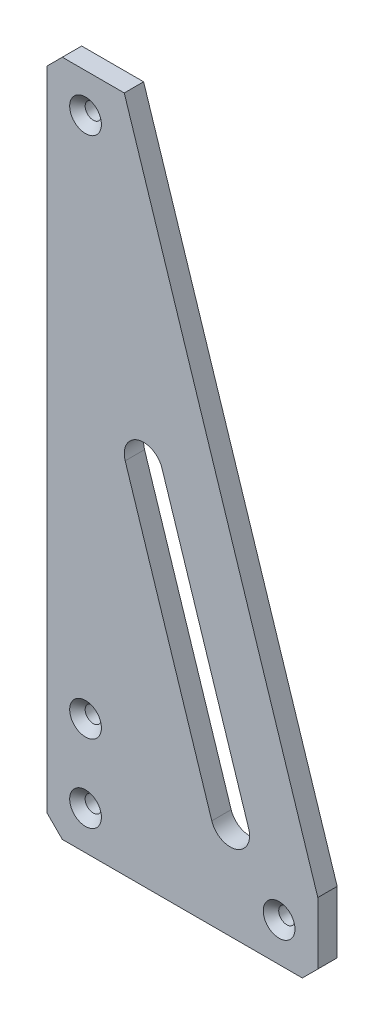
ISO-10303-21;
HEADER;
FILE_DESCRIPTION(('STEP AP214'),'2;1');
FILE_NAME('part.step','',(''),(''),'','','');
FILE_SCHEMA(('AUTOMOTIVE_DESIGN { 1 0 10303 214 1 1 1 1 }'));
ENDSEC;
DATA;
#1=APPLICATION_CONTEXT('core data for automotive mechanical design processes');
#2=APPLICATION_PROTOCOL_DEFINITION('international standard','automotive_design',2000,#1);
#3=PRODUCT_CONTEXT('',#1,'mechanical');
#4=PRODUCT('Part','Part','',(#3));
#5=PRODUCT_RELATED_PRODUCT_CATEGORY('part','',(#4));
#6=PRODUCT_DEFINITION_FORMATION('','',#4);
#7=PRODUCT_DEFINITION_CONTEXT('part definition',#1,'design');
#8=PRODUCT_DEFINITION('design','',#6,#7);
#9=PRODUCT_DEFINITION_SHAPE('','',#8);
#10=(LENGTH_UNIT() NAMED_UNIT(*) SI_UNIT(.MILLI.,.METRE.));
#11=(NAMED_UNIT(*) PLANE_ANGLE_UNIT() SI_UNIT($,.RADIAN.));
#12=(NAMED_UNIT(*) SI_UNIT($,.STERADIAN.) SOLID_ANGLE_UNIT());
#13=UNCERTAINTY_MEASURE_WITH_UNIT(LENGTH_MEASURE(1.E-05),#10,'distance_accuracy_value','');
#14=(GEOMETRIC_REPRESENTATION_CONTEXT(3) GLOBAL_UNCERTAINTY_ASSIGNED_CONTEXT((#13)) GLOBAL_UNIT_ASSIGNED_CONTEXT((#10,
#11,#12)) REPRESENTATION_CONTEXT('',''));
#15=CARTESIAN_POINT('',(0.,0.,0.));
#16=DIRECTION('',(0.,0.,1.));
#17=DIRECTION('',(1.,0.,0.));
#18=AXIS2_PLACEMENT_3D('',#15,#16,#17);
#19=CARTESIAN_POINT('',(0.,0.,2.5));
#20=DIRECTION('',(0.,0.,1.));
#21=DIRECTION('',(1.,0.,0.));
#22=AXIS2_PLACEMENT_3D('',#19,#20,#21);
#23=PLANE('',#22);
#24=CARTESIAN_POINT('',(12.3722613227067,-62.5,2.5));
#25=DIRECTION('',(0.,0.,-1.));
#26=DIRECTION('',(-1.,0.,0.));
#27=AXIS2_PLACEMENT_3D('',#24,#25,#26);
#28=CIRCLE('',#27,5.);
#29=CARTESIAN_POINT('',(17.1308044115095,-60.9649861003862,2.5));
#30=VERTEX_POINT('',#29);
#31=CARTESIAN_POINT('',(7.61371823390396,-64.0350138996138,2.5));
#32=VERTEX_POINT('',#31);
#33=EDGE_CURVE('E129',#30,#32,#28,.T.);
#34=ORIENTED_EDGE('',*,*,#33,.T.);
#35=DIRECTION('',(-0.307002779922759,0.951708617760551,0.));
#36=VECTOR('',#35,1.);
#37=CARTESIAN_POINT('',(7.61371823390396,-64.0350138996138,2.5));
#38=LINE('',#37,#36);
#39=CARTESIAN_POINT('',(-14.7585430888028,5.31899620077691,2.5));
#40=VERTEX_POINT('',#39);
#41=EDGE_CURVE('E138',#32,#40,#38,.T.);
#42=ORIENTED_EDGE('',*,*,#41,.T.);
#43=CARTESIAN_POINT('',(-10.,6.8540101003907,2.5));
#44=DIRECTION('',(0.,0.,-1.));
#45=DIRECTION('',(-1.,0.,0.));
#46=AXIS2_PLACEMENT_3D('',#43,#44,#45);
#47=CIRCLE('',#46,4.99999999999999);
#48=CARTESIAN_POINT('',(-5.24145691119726,8.3890240000045,2.5));
#49=VERTEX_POINT('',#48);
#50=EDGE_CURVE('E53',#40,#49,#47,.T.);
#51=ORIENTED_EDGE('',*,*,#50,.T.);
#52=DIRECTION('',(0.307002779922759,-0.951708617760551,0.));
#53=VECTOR('',#52,1.);
#54=CARTESIAN_POINT('',(17.1308044115095,-60.9649861003862,2.5));
#55=LINE('',#54,#53);
#56=EDGE_CURVE('E135',#49,#30,#55,.T.);
#57=ORIENTED_EDGE('',*,*,#56,.T.);
#58=EDGE_LOOP('',(#34,#42,#51,#57));
#59=FACE_BOUND('',#58,.T.);
#60=CARTESIAN_POINT('',(-25.,77.5,2.5));
#61=DIRECTION('',(0.,0.,1.));
#62=DIRECTION('',(1.,0.,0.));
#63=AXIS2_PLACEMENT_3D('',#60,#61,#62);
#64=CIRCLE('',#63,4.09999999999999);
#65=CARTESIAN_POINT('',(-20.9,77.5,2.5));
#66=VERTEX_POINT('',#65);
#67=EDGE_CURVE('E245',#66,#66,#64,.F.);
#68=ORIENTED_EDGE('',*,*,#67,.T.);
#69=EDGE_LOOP('',(#68));
#70=FACE_BOUND('',#69,.T.);
#71=CARTESIAN_POINT('',(25.,-77.5,2.5));
#72=DIRECTION('',(0.,0.,1.));
#73=DIRECTION('',(1.,0.,0.));
#74=AXIS2_PLACEMENT_3D('',#71,#72,#73);
#75=CIRCLE('',#74,4.09999999999999);
#76=CARTESIAN_POINT('',(29.1,-77.5,2.5));
#77=VERTEX_POINT('',#76);
#78=EDGE_CURVE('E242',#77,#77,#75,.F.);
#79=ORIENTED_EDGE('',*,*,#78,.T.);
#80=EDGE_LOOP('',(#79));
#81=FACE_BOUND('',#80,.T.);
#82=CARTESIAN_POINT('',(-25.,-57.5,2.5));
#83=DIRECTION('',(0.,0.,1.));
#84=DIRECTION('',(1.,0.,0.));
#85=AXIS2_PLACEMENT_3D('',#82,#83,#84);
#86=CIRCLE('',#85,4.10000000000002);
#87=CARTESIAN_POINT('',(-20.9,-57.5,2.5));
#88=VERTEX_POINT('',#87);
#89=EDGE_CURVE('E239',#88,#88,#86,.F.);
#90=ORIENTED_EDGE('',*,*,#89,.T.);
#91=EDGE_LOOP('',(#90));
#92=FACE_BOUND('',#91,.T.);
#93=CARTESIAN_POINT('',(-25.,-77.5,2.5));
#94=DIRECTION('',(0.,0.,1.));
#95=DIRECTION('',(1.,0.,0.));
#96=AXIS2_PLACEMENT_3D('',#93,#94,#95);
#97=CIRCLE('',#96,4.09999999999999);
#98=CARTESIAN_POINT('',(-20.9,-77.5,2.5));
#99=VERTEX_POINT('',#98);
#100=EDGE_CURVE('E236',#99,#99,#97,.F.);
#101=ORIENTED_EDGE('',*,*,#100,.T.);
#102=EDGE_LOOP('',(#101));
#103=FACE_BOUND('',#102,.T.);
#104=DIRECTION('',(1.,0.,0.));
#105=VECTOR('',#104,1.);
#106=CARTESIAN_POINT('',(-35.,-87.5,2.5));
#107=LINE('',#106,#105);
#108=CARTESIAN_POINT('',(-31.,-87.5,2.5));
#109=VERTEX_POINT('',#108);
#110=CARTESIAN_POINT('',(31.,-87.5,2.5));
#111=VERTEX_POINT('',#110);
#112=EDGE_CURVE('E175',#109,#111,#107,.T.);
#113=ORIENTED_EDGE('',*,*,#112,.T.);
#114=DIRECTION('',(-0.707106781186551,-0.707106781186544,0.));
#115=VECTOR('',#114,1.);
#116=CARTESIAN_POINT('',(59.2499999999999,-59.2500000000004,2.5));
#117=LINE('',#116,#115);
#118=CARTESIAN_POINT('',(35.,-83.5,2.5));
#119=VERTEX_POINT('',#118);
#120=EDGE_CURVE('E224',#111,#119,#117,.F.);
#121=ORIENTED_EDGE('',*,*,#120,.T.);
#122=DIRECTION('',(0.,1.,0.));
#123=VECTOR('',#122,1.);
#124=CARTESIAN_POINT('',(35.,-87.5,2.5));
#125=LINE('',#124,#123);
#126=CARTESIAN_POINT('',(35.,-67.5,2.5));
#127=VERTEX_POINT('',#126);
#128=EDGE_CURVE('E178',#119,#127,#125,.T.);
#129=ORIENTED_EDGE('',*,*,#128,.T.);
#130=DIRECTION('',(-0.307002779922759,0.951708617760551,0.));
#131=VECTOR('',#130,1.);
#132=CARTESIAN_POINT('',(35.,-67.5,2.5));
#133=LINE('',#132,#131);
#134=CARTESIAN_POINT('',(-15.,87.5,2.5));
#135=VERTEX_POINT('',#134);
#136=EDGE_CURVE('E181',#127,#135,#133,.T.);
#137=ORIENTED_EDGE('',*,*,#136,.T.);
#138=DIRECTION('',(-1.,0.,0.));
#139=VECTOR('',#138,1.);
#140=CARTESIAN_POINT('',(-15.,87.5,2.5));
#141=LINE('',#140,#139);
#142=CARTESIAN_POINT('',(-31.,87.5,2.5));
#143=VERTEX_POINT('',#142);
#144=EDGE_CURVE('E183',#135,#143,#141,.T.);
#145=ORIENTED_EDGE('',*,*,#144,.T.);
#146=DIRECTION('',(0.70710678118655,0.707106781186545,0.));
#147=VECTOR('',#146,1.);
#148=CARTESIAN_POINT('',(-59.2499999999999,59.2500000000003,2.5));
#149=LINE('',#148,#147);
#150=CARTESIAN_POINT('',(-35.,83.5,2.5));
#151=VERTEX_POINT('',#150);
#152=EDGE_CURVE('E220',#143,#151,#149,.F.);
#153=ORIENTED_EDGE('',*,*,#152,.T.);
#154=DIRECTION('',(0.,-1.,0.));
#155=VECTOR('',#154,1.);
#156=CARTESIAN_POINT('',(-35.,87.5,2.5));
#157=LINE('',#156,#155);
#158=CARTESIAN_POINT('',(-35.,-83.5,2.5));
#159=VERTEX_POINT('',#158);
#160=EDGE_CURVE('E186',#151,#159,#157,.T.);
#161=ORIENTED_EDGE('',*,*,#160,.T.);
#162=DIRECTION('',(-0.707106781186545,0.70710678118655,0.));
#163=VECTOR('',#162,1.);
#164=CARTESIAN_POINT('',(-59.2500000000001,-59.2499999999997,2.5));
#165=LINE('',#164,#163);
#166=EDGE_CURVE('E222',#159,#109,#165,.F.);
#167=ORIENTED_EDGE('',*,*,#166,.T.);
#168=EDGE_LOOP('',(#113,#121,#129,#137,#145,#153,#161,#167));
#169=FACE_BOUND('',#168,.T.);
#170=ADVANCED_FACE('F37',(#59,#70,#81,#92,#103,#169),#23,.T.);
#171=CARTESIAN_POINT('',(0.,0.,-2.5));
#172=DIRECTION('',(0.,0.,1.));
#173=DIRECTION('',(1.,0.,0.));
#174=AXIS2_PLACEMENT_3D('',#171,#172,#173);
#175=PLANE('',#174);
#176=DIRECTION('',(-0.307002779922759,0.951708617760551,0.));
#177=VECTOR('',#176,1.);
#178=CARTESIAN_POINT('',(7.61371823390396,-64.0350138996138,-2.5));
#179=LINE('',#178,#177);
#180=CARTESIAN_POINT('',(7.61371823390396,-64.0350138996138,-2.5));
#181=VERTEX_POINT('',#180);
#182=CARTESIAN_POINT('',(-14.7585430888028,5.31899620077691,-2.5));
#183=VERTEX_POINT('',#182);
#184=EDGE_CURVE('E153',#181,#183,#179,.T.);
#185=ORIENTED_EDGE('',*,*,#184,.F.);
#186=CARTESIAN_POINT('',(12.3722613227067,-62.5,-2.5));
#187=DIRECTION('',(0.,0.,-1.));
#188=DIRECTION('',(-1.,0.,0.));
#189=AXIS2_PLACEMENT_3D('',#186,#187,#188);
#190=CIRCLE('',#189,5.);
#191=CARTESIAN_POINT('',(17.1308044115095,-60.9649861003862,-2.5));
#192=VERTEX_POINT('',#191);
#193=EDGE_CURVE('E61',#192,#181,#190,.T.);
#194=ORIENTED_EDGE('',*,*,#193,.F.);
#195=DIRECTION('',(0.307002779922759,-0.951708617760551,0.));
#196=VECTOR('',#195,1.);
#197=CARTESIAN_POINT('',(17.1308044115095,-60.9649861003862,-2.5));
#198=LINE('',#197,#196);
#199=CARTESIAN_POINT('',(-5.24145691119726,8.3890240000045,-2.5));
#200=VERTEX_POINT('',#199);
#201=EDGE_CURVE('E144',#200,#192,#198,.T.);
#202=ORIENTED_EDGE('',*,*,#201,.F.);
#203=CARTESIAN_POINT('',(-10.,6.8540101003907,-2.5));
#204=DIRECTION('',(0.,0.,-1.));
#205=DIRECTION('',(-1.,0.,0.));
#206=AXIS2_PLACEMENT_3D('',#203,#204,#205);
#207=CIRCLE('',#206,4.99999999999999);
#208=EDGE_CURVE('E147',#183,#200,#207,.T.);
#209=ORIENTED_EDGE('',*,*,#208,.F.);
#210=EDGE_LOOP('',(#185,#194,#202,#209));
#211=FACE_BOUND('',#210,.T.);
#212=DIRECTION('',(0.,1.,0.));
#213=VECTOR('',#212,1.);
#214=CARTESIAN_POINT('',(35.,-87.5,-2.5));
#215=LINE('',#214,#213);
#216=CARTESIAN_POINT('',(35.,-83.5,-2.5));
#217=VERTEX_POINT('',#216);
#218=CARTESIAN_POINT('',(35.,-67.5,-2.5));
#219=VERTEX_POINT('',#218);
#220=EDGE_CURVE('E192',#217,#219,#215,.T.);
#221=ORIENTED_EDGE('',*,*,#220,.F.);
#222=DIRECTION('',(0.707106781186551,0.707106781186544,0.));
#223=VECTOR('',#222,1.);
#224=CARTESIAN_POINT('',(35.,-83.5,-2.5));
#225=LINE('',#224,#223);
#226=CARTESIAN_POINT('',(31.,-87.5,-2.5));
#227=VERTEX_POINT('',#226);
#228=EDGE_CURVE('E213',#217,#227,#225,.F.);
#229=ORIENTED_EDGE('',*,*,#228,.T.);
#230=DIRECTION('',(1.,0.,0.));
#231=VECTOR('',#230,1.);
#232=CARTESIAN_POINT('',(-35.,-87.5,-2.5));
#233=LINE('',#232,#231);
#234=CARTESIAN_POINT('',(-31.,-87.5,-2.5));
#235=VERTEX_POINT('',#234);
#236=EDGE_CURVE('E174',#235,#227,#233,.T.);
#237=ORIENTED_EDGE('',*,*,#236,.F.);
#238=DIRECTION('',(0.707106781186545,-0.70710678118655,0.));
#239=VECTOR('',#238,1.);
#240=CARTESIAN_POINT('',(-31.,-87.5,-2.5));
#241=LINE('',#240,#239);
#242=CARTESIAN_POINT('',(-35.,-83.5,-2.5));
#243=VERTEX_POINT('',#242);
#244=EDGE_CURVE('E211',#235,#243,#241,.F.);
#245=ORIENTED_EDGE('',*,*,#244,.T.);
#246=DIRECTION('',(0.,-1.,0.));
#247=VECTOR('',#246,1.);
#248=CARTESIAN_POINT('',(-35.,87.5,-2.5));
#249=LINE('',#248,#247);
#250=CARTESIAN_POINT('',(-35.,83.5,-2.5));
#251=VERTEX_POINT('',#250);
#252=EDGE_CURVE('E179',#251,#243,#249,.T.);
#253=ORIENTED_EDGE('',*,*,#252,.F.);
#254=DIRECTION('',(-0.70710678118655,-0.707106781186545,0.));
#255=VECTOR('',#254,1.);
#256=CARTESIAN_POINT('',(-35.,83.5,-2.5));
#257=LINE('',#256,#255);
#258=CARTESIAN_POINT('',(-31.,87.5,-2.5));
#259=VERTEX_POINT('',#258);
#260=EDGE_CURVE('E209',#251,#259,#257,.F.);
#261=ORIENTED_EDGE('',*,*,#260,.T.);
#262=DIRECTION('',(-1.,0.,0.));
#263=VECTOR('',#262,1.);
#264=CARTESIAN_POINT('',(-15.,87.5,-2.5));
#265=LINE('',#264,#263);
#266=CARTESIAN_POINT('',(-15.,87.5,-2.5));
#267=VERTEX_POINT('',#266);
#268=EDGE_CURVE('E196',#267,#259,#265,.T.);
#269=ORIENTED_EDGE('',*,*,#268,.F.);
#270=DIRECTION('',(-0.307002779922759,0.951708617760551,0.));
#271=VECTOR('',#270,1.);
#272=CARTESIAN_POINT('',(35.,-67.5,-2.5));
#273=LINE('',#272,#271);
#274=EDGE_CURVE('E194',#219,#267,#273,.T.);
#275=ORIENTED_EDGE('',*,*,#274,.F.);
#276=EDGE_LOOP('',(#221,#229,#237,#245,#253,#261,#269,#275));
#277=FACE_BOUND('',#276,.T.);
#278=CARTESIAN_POINT('',(25.,-77.5,-2.5));
#279=DIRECTION('',(0.,0.,1.));
#280=DIRECTION('',(1.,0.,0.));
#281=AXIS2_PLACEMENT_3D('',#278,#279,#280);
#282=CIRCLE('',#281,2.1);
#283=CARTESIAN_POINT('',(27.1,-77.5,-2.5));
#284=VERTEX_POINT('',#283);
#285=EDGE_CURVE('E171',#284,#284,#282,.T.);
#286=ORIENTED_EDGE('',*,*,#285,.T.);
#287=EDGE_LOOP('',(#286));
#288=FACE_BOUND('',#287,.T.);
#289=CARTESIAN_POINT('',(-25.,-77.5,-2.5));
#290=DIRECTION('',(0.,0.,1.));
#291=DIRECTION('',(1.,0.,0.));
#292=AXIS2_PLACEMENT_3D('',#289,#290,#291);
#293=CIRCLE('',#292,2.1);
#294=CARTESIAN_POINT('',(-22.9,-77.5,-2.5));
#295=VERTEX_POINT('',#294);
#296=EDGE_CURVE('E168',#295,#295,#293,.T.);
#297=ORIENTED_EDGE('',*,*,#296,.T.);
#298=EDGE_LOOP('',(#297));
#299=FACE_BOUND('',#298,.T.);
#300=CARTESIAN_POINT('',(-25.,77.5,-2.5));
#301=DIRECTION('',(0.,0.,1.));
#302=DIRECTION('',(1.,0.,0.));
#303=AXIS2_PLACEMENT_3D('',#300,#301,#302);
#304=CIRCLE('',#303,2.1);
#305=CARTESIAN_POINT('',(-22.9,77.5,-2.5));
#306=VERTEX_POINT('',#305);
#307=EDGE_CURVE('E165',#306,#306,#304,.T.);
#308=ORIENTED_EDGE('',*,*,#307,.T.);
#309=EDGE_LOOP('',(#308));
#310=FACE_BOUND('',#309,.T.);
#311=CARTESIAN_POINT('',(-25.,-57.5,-2.5));
#312=DIRECTION('',(0.,0.,1.));
#313=DIRECTION('',(1.,0.,0.));
#314=AXIS2_PLACEMENT_3D('',#311,#312,#313);
#315=CIRCLE('',#314,2.1);
#316=CARTESIAN_POINT('',(-22.9,-57.5,-2.5));
#317=VERTEX_POINT('',#316);
#318=EDGE_CURVE('E159',#317,#317,#315,.T.);
#319=ORIENTED_EDGE('',*,*,#318,.T.);
#320=EDGE_LOOP('',(#319));
#321=FACE_BOUND('',#320,.T.);
#322=ADVANCED_FACE('F271',(#211,#277,#288,#299,#310,#321),#175,.F.);
#323=CARTESIAN_POINT('',(-35.,-87.5,2.5));
#324=DIRECTION('',(0.,1.,0.));
#325=DIRECTION('',(0.,0.,1.));
#326=AXIS2_PLACEMENT_3D('',#323,#324,#325);
#327=PLANE('',#326);
#328=ORIENTED_EDGE('',*,*,#236,.T.);
#329=DIRECTION('',(0.,0.,1.));
#330=VECTOR('',#329,1.);
#331=CARTESIAN_POINT('',(31.,-87.5,2.5));
#332=LINE('',#331,#330);
#333=EDGE_CURVE('E218',#227,#111,#332,.T.);
#334=ORIENTED_EDGE('',*,*,#333,.T.);
#335=ORIENTED_EDGE('',*,*,#112,.F.);
#336=DIRECTION('',(0.,0.,-1.));
#337=VECTOR('',#336,1.);
#338=CARTESIAN_POINT('',(-31.,-87.5,2.5));
#339=LINE('',#338,#337);
#340=EDGE_CURVE('E215',#109,#235,#339,.T.);
#341=ORIENTED_EDGE('',*,*,#340,.T.);
#342=EDGE_LOOP('',(#328,#334,#335,#341));
#343=FACE_BOUND('',#342,.T.);
#344=ADVANCED_FACE('F276',(#343),#327,.F.);
#345=CARTESIAN_POINT('',(35.,-87.5,2.5));
#346=DIRECTION('',(-1.,0.,0.));
#347=DIRECTION('',(0.,-1.,0.));
#348=AXIS2_PLACEMENT_3D('',#345,#346,#347);
#349=PLANE('',#348);
#350=ORIENTED_EDGE('',*,*,#128,.F.);
#351=DIRECTION('',(0.,0.,-1.));
#352=VECTOR('',#351,1.);
#353=CARTESIAN_POINT('',(35.,-83.5,2.5));
#354=LINE('',#353,#352);
#355=EDGE_CURVE('E206',#119,#217,#354,.T.);
#356=ORIENTED_EDGE('',*,*,#355,.T.);
#357=ORIENTED_EDGE('',*,*,#220,.T.);
#358=DIRECTION('',(0.,0.,-1.));
#359=VECTOR('',#358,1.);
#360=CARTESIAN_POINT('',(35.,-67.5,2.5));
#361=LINE('',#360,#359);
#362=EDGE_CURVE('E203',#127,#219,#361,.T.);
#363=ORIENTED_EDGE('',*,*,#362,.F.);
#364=EDGE_LOOP('',(#350,#356,#357,#363));
#365=FACE_BOUND('',#364,.T.);
#366=ADVANCED_FACE('F294',(#365),#349,.F.);
#367=CARTESIAN_POINT('',(35.,-67.5,2.5));
#368=DIRECTION('',(-0.951708617760551,-0.307002779922759,0.));
#369=DIRECTION('',(0.307002779922759,-0.951708617760551,0.));
#370=AXIS2_PLACEMENT_3D('',#367,#368,#369);
#371=PLANE('',#370);
#372=ORIENTED_EDGE('',*,*,#274,.T.);
#373=DIRECTION('',(0.,0.,-1.));
#374=VECTOR('',#373,1.);
#375=CARTESIAN_POINT('',(-15.,87.5,2.5));
#376=LINE('',#375,#374);
#377=EDGE_CURVE('E189',#135,#267,#376,.T.);
#378=ORIENTED_EDGE('',*,*,#377,.F.);
#379=ORIENTED_EDGE('',*,*,#136,.F.);
#380=ORIENTED_EDGE('',*,*,#362,.T.);
#381=EDGE_LOOP('',(#372,#378,#379,#380));
#382=FACE_BOUND('',#381,.T.);
#383=ADVANCED_FACE('F290',(#382),#371,.F.);
#384=CARTESIAN_POINT('',(-15.,87.5,2.5));
#385=DIRECTION('',(0.,-1.,0.));
#386=DIRECTION('',(0.,0.,-1.));
#387=AXIS2_PLACEMENT_3D('',#384,#385,#386);
#388=PLANE('',#387);
#389=ORIENTED_EDGE('',*,*,#268,.T.);
#390=DIRECTION('',(0.,0.,1.));
#391=VECTOR('',#390,1.);
#392=CARTESIAN_POINT('',(-31.,87.5,2.5));
#393=LINE('',#392,#391);
#394=EDGE_CURVE('E231',#259,#143,#393,.T.);
#395=ORIENTED_EDGE('',*,*,#394,.T.);
#396=ORIENTED_EDGE('',*,*,#144,.F.);
#397=ORIENTED_EDGE('',*,*,#377,.T.);
#398=EDGE_LOOP('',(#389,#395,#396,#397));
#399=FACE_BOUND('',#398,.T.);
#400=ADVANCED_FACE('F286',(#399),#388,.F.);
#401=CARTESIAN_POINT('',(-35.,87.5,2.5));
#402=DIRECTION('',(1.,0.,0.));
#403=DIRECTION('',(0.,0.,-1.));
#404=AXIS2_PLACEMENT_3D('',#401,#402,#403);
#405=PLANE('',#404);
#406=ORIENTED_EDGE('',*,*,#252,.T.);
#407=DIRECTION('',(0.,0.,1.));
#408=VECTOR('',#407,1.);
#409=CARTESIAN_POINT('',(-35.,-83.5,2.5));
#410=LINE('',#409,#408);
#411=EDGE_CURVE('E229',#243,#159,#410,.T.);
#412=ORIENTED_EDGE('',*,*,#411,.T.);
#413=ORIENTED_EDGE('',*,*,#160,.F.);
#414=DIRECTION('',(0.,0.,-1.));
#415=VECTOR('',#414,1.);
#416=CARTESIAN_POINT('',(-35.,83.5,2.5));
#417=LINE('',#416,#415);
#418=EDGE_CURVE('E226',#151,#251,#417,.T.);
#419=ORIENTED_EDGE('',*,*,#418,.T.);
#420=EDGE_LOOP('',(#406,#412,#413,#419));
#421=FACE_BOUND('',#420,.T.);
#422=ADVANCED_FACE('F283',(#421),#405,.F.);
#423=CARTESIAN_POINT('',(25.,-77.5,2.5));
#424=DIRECTION('',(0.,0.,-1.));
#425=DIRECTION('',(-1.,0.,0.));
#426=AXIS2_PLACEMENT_3D('',#423,#424,#425);
#427=CYLINDRICAL_SURFACE('',#426,2.1);
#428=CARTESIAN_POINT('',(25.,-77.5,0.500000000000026));
#429=DIRECTION('',(0.,0.,1.));
#430=DIRECTION('',(1.,0.,0.));
#431=AXIS2_PLACEMENT_3D('',#428,#429,#430);
#432=CIRCLE('',#431,2.1);
#433=CARTESIAN_POINT('',(27.1,-77.5,0.500000000000026));
#434=VERTEX_POINT('',#433);
#435=EDGE_CURVE('E248',#434,#434,#432,.T.);
#436=ORIENTED_EDGE('',*,*,#435,.T.);
#437=EDGE_LOOP('',(#436));
#438=FACE_BOUND('',#437,.T.);
#439=ORIENTED_EDGE('',*,*,#285,.F.);
#440=EDGE_LOOP('',(#439));
#441=FACE_BOUND('',#440,.T.);
#442=ADVANCED_FACE('F280',(#438,#441),#427,.F.);
#443=CARTESIAN_POINT('',(-25.,-77.5,2.5));
#444=DIRECTION('',(0.,0.,-1.));
#445=DIRECTION('',(-1.,0.,0.));
#446=AXIS2_PLACEMENT_3D('',#443,#444,#445);
#447=CYLINDRICAL_SURFACE('',#446,2.1);
#448=CARTESIAN_POINT('',(-25.,-77.5,0.500000000000026));
#449=DIRECTION('',(0.,0.,1.));
#450=DIRECTION('',(1.,0.,0.));
#451=AXIS2_PLACEMENT_3D('',#448,#449,#450);
#452=CIRCLE('',#451,2.1);
#453=CARTESIAN_POINT('',(-22.9,-77.5,0.500000000000026));
#454=VERTEX_POINT('',#453);
#455=EDGE_CURVE('E11',#454,#454,#452,.T.);
#456=ORIENTED_EDGE('',*,*,#455,.T.);
#457=EDGE_LOOP('',(#456));
#458=FACE_BOUND('',#457,.T.);
#459=ORIENTED_EDGE('',*,*,#296,.F.);
#460=EDGE_LOOP('',(#459));
#461=FACE_BOUND('',#460,.T.);
#462=ADVANCED_FACE('F344',(#458,#461),#447,.F.);
#463=CARTESIAN_POINT('',(-25.,77.5,2.5));
#464=DIRECTION('',(0.,0.,-1.));
#465=DIRECTION('',(-1.,0.,0.));
#466=AXIS2_PLACEMENT_3D('',#463,#464,#465);
#467=CYLINDRICAL_SURFACE('',#466,2.1);
#468=CARTESIAN_POINT('',(-25.,77.5,0.500000000000026));
#469=DIRECTION('',(0.,0.,1.));
#470=DIRECTION('',(1.,0.,0.));
#471=AXIS2_PLACEMENT_3D('',#468,#469,#470);
#472=CIRCLE('',#471,2.1);
#473=CARTESIAN_POINT('',(-22.9,77.5,0.500000000000026));
#474=VERTEX_POINT('',#473);
#475=EDGE_CURVE('E233',#474,#474,#472,.T.);
#476=ORIENTED_EDGE('',*,*,#475,.T.);
#477=EDGE_LOOP('',(#476));
#478=FACE_BOUND('',#477,.T.);
#479=ORIENTED_EDGE('',*,*,#307,.F.);
#480=EDGE_LOOP('',(#479));
#481=FACE_BOUND('',#480,.T.);
#482=ADVANCED_FACE('F341',(#478,#481),#467,.F.);
#483=CARTESIAN_POINT('',(-25.,-57.5,2.5));
#484=DIRECTION('',(0.,0.,-1.));
#485=DIRECTION('',(-1.,0.,0.));
#486=AXIS2_PLACEMENT_3D('',#483,#484,#485);
#487=CYLINDRICAL_SURFACE('',#486,2.1);
#488=CARTESIAN_POINT('',(-25.,-57.5,0.5));
#489=DIRECTION('',(0.,0.,1.));
#490=DIRECTION('',(1.,0.,0.));
#491=AXIS2_PLACEMENT_3D('',#488,#489,#490);
#492=CIRCLE('',#491,2.1);
#493=CARTESIAN_POINT('',(-22.9,-57.5,0.5));
#494=VERTEX_POINT('',#493);
#495=EDGE_CURVE('E46',#494,#494,#492,.T.);
#496=ORIENTED_EDGE('',*,*,#495,.T.);
#497=EDGE_LOOP('',(#496));
#498=FACE_BOUND('',#497,.T.);
#499=ORIENTED_EDGE('',*,*,#318,.F.);
#500=EDGE_LOOP('',(#499));
#501=FACE_BOUND('',#500,.T.);
#502=ADVANCED_FACE('F253',(#498,#501),#487,.F.);
#503=CARTESIAN_POINT('',(35.,-83.5,2.5));
#504=DIRECTION('',(-0.707106781186544,0.707106781186551,0.));
#505=DIRECTION('',(0.,0.,-1.));
#506=AXIS2_PLACEMENT_3D('',#503,#504,#505);
#507=PLANE('',#506);
#508=ORIENTED_EDGE('',*,*,#120,.F.);
#509=ORIENTED_EDGE('',*,*,#333,.F.);
#510=ORIENTED_EDGE('',*,*,#228,.F.);
#511=ORIENTED_EDGE('',*,*,#355,.F.);
#512=EDGE_LOOP('',(#508,#509,#510,#511));
#513=FACE_BOUND('',#512,.T.);
#514=ADVANCED_FACE('F303',(#513),#507,.F.);
#515=CARTESIAN_POINT('',(-31.,-87.5,2.5));
#516=DIRECTION('',(0.70710678118655,0.707106781186545,0.));
#517=DIRECTION('',(0.,0.,-1.));
#518=AXIS2_PLACEMENT_3D('',#515,#516,#517);
#519=PLANE('',#518);
#520=ORIENTED_EDGE('',*,*,#166,.F.);
#521=ORIENTED_EDGE('',*,*,#411,.F.);
#522=ORIENTED_EDGE('',*,*,#244,.F.);
#523=ORIENTED_EDGE('',*,*,#340,.F.);
#524=EDGE_LOOP('',(#520,#521,#522,#523));
#525=FACE_BOUND('',#524,.T.);
#526=ADVANCED_FACE('F309',(#525),#519,.F.);
#527=CARTESIAN_POINT('',(-35.,83.5,2.5));
#528=DIRECTION('',(0.707106781186545,-0.70710678118655,0.));
#529=DIRECTION('',(0.,0.,-1.));
#530=AXIS2_PLACEMENT_3D('',#527,#528,#529);
#531=PLANE('',#530);
#532=ORIENTED_EDGE('',*,*,#152,.F.);
#533=ORIENTED_EDGE('',*,*,#394,.F.);
#534=ORIENTED_EDGE('',*,*,#260,.F.);
#535=ORIENTED_EDGE('',*,*,#418,.F.);
#536=EDGE_LOOP('',(#532,#533,#534,#535));
#537=FACE_BOUND('',#536,.T.);
#538=ADVANCED_FACE('F316',(#537),#531,.F.);
#539=CARTESIAN_POINT('',(-25.,77.5,0.500000000000026));
#540=DIRECTION('',(0.,0.,1.));
#541=DIRECTION('',(1.,0.,0.));
#542=AXIS2_PLACEMENT_3D('',#539,#540,#541);
#543=CONICAL_SURFACE('',#542,2.1,0.785398163397453);
#544=ORIENTED_EDGE('',*,*,#67,.F.);
#545=EDGE_LOOP('',(#544));
#546=FACE_BOUND('',#545,.T.);
#547=ORIENTED_EDGE('',*,*,#475,.F.);
#548=EDGE_LOOP('',(#547));
#549=FACE_BOUND('',#548,.T.);
#550=ADVANCED_FACE('F265',(#546,#549),#543,.F.);
#551=CARTESIAN_POINT('',(25.,-77.5,0.500000000000026));
#552=DIRECTION('',(0.,0.,1.));
#553=DIRECTION('',(1.,0.,0.));
#554=AXIS2_PLACEMENT_3D('',#551,#552,#553);
#555=CONICAL_SURFACE('',#554,2.1,0.785398163397453);
#556=ORIENTED_EDGE('',*,*,#78,.F.);
#557=EDGE_LOOP('',(#556));
#558=FACE_BOUND('',#557,.T.);
#559=ORIENTED_EDGE('',*,*,#435,.F.);
#560=EDGE_LOOP('',(#559));
#561=FACE_BOUND('',#560,.T.);
#562=ADVANCED_FACE('F258',(#558,#561),#555,.F.);
#563=CARTESIAN_POINT('',(-25.,-57.5,0.5));
#564=DIRECTION('',(0.,0.,1.));
#565=DIRECTION('',(1.,0.,0.));
#566=AXIS2_PLACEMENT_3D('',#563,#564,#565);
#567=CONICAL_SURFACE('',#566,2.1,0.785398163397453);
#568=ORIENTED_EDGE('',*,*,#89,.F.);
#569=EDGE_LOOP('',(#568));
#570=FACE_BOUND('',#569,.T.);
#571=ORIENTED_EDGE('',*,*,#495,.F.);
#572=EDGE_LOOP('',(#571));
#573=FACE_BOUND('',#572,.T.);
#574=ADVANCED_FACE('F256',(#570,#573),#567,.F.);
#575=CARTESIAN_POINT('',(-25.,-77.5,0.500000000000026));
#576=DIRECTION('',(0.,0.,1.));
#577=DIRECTION('',(1.,0.,0.));
#578=AXIS2_PLACEMENT_3D('',#575,#576,#577);
#579=CONICAL_SURFACE('',#578,2.1,0.785398163397453);
#580=ORIENTED_EDGE('',*,*,#100,.F.);
#581=EDGE_LOOP('',(#580));
#582=FACE_BOUND('',#581,.T.);
#583=ORIENTED_EDGE('',*,*,#455,.F.);
#584=EDGE_LOOP('',(#583));
#585=FACE_BOUND('',#584,.T.);
#586=ADVANCED_FACE('F40',(#582,#585),#579,.F.);
#587=CARTESIAN_POINT('',(12.3722613227067,-62.5,2.5));
#588=DIRECTION('',(0.,0.,-1.));
#589=DIRECTION('',(-1.,0.,0.));
#590=AXIS2_PLACEMENT_3D('',#587,#588,#589);
#591=CYLINDRICAL_SURFACE('',#590,5.);
#592=ORIENTED_EDGE('',*,*,#193,.T.);
#593=DIRECTION('',(0.,0.,-1.));
#594=VECTOR('',#593,1.);
#595=CARTESIAN_POINT('',(7.61371823390396,-64.0350138996138,2.5));
#596=LINE('',#595,#594);
#597=EDGE_CURVE('E125',#32,#181,#596,.T.);
#598=ORIENTED_EDGE('',*,*,#597,.F.);
#599=ORIENTED_EDGE('',*,*,#33,.F.);
#600=DIRECTION('',(0.,0.,-1.));
#601=VECTOR('',#600,1.);
#602=CARTESIAN_POINT('',(17.1308044115095,-60.9649861003862,2.5));
#603=LINE('',#602,#601);
#604=EDGE_CURVE('E157',#30,#192,#603,.T.);
#605=ORIENTED_EDGE('',*,*,#604,.T.);
#606=EDGE_LOOP('',(#592,#598,#599,#605));
#607=FACE_BOUND('',#606,.T.);
#608=ADVANCED_FACE('F127',(#607),#591,.F.);
#609=CARTESIAN_POINT('',(17.1308044115095,-60.9649861003862,2.5));
#610=DIRECTION('',(0.951708617760551,0.307002779922759,0.));
#611=DIRECTION('',(-0.307002779922759,0.951708617760551,0.));
#612=AXIS2_PLACEMENT_3D('',#609,#610,#611);
#613=PLANE('',#612);
#614=ORIENTED_EDGE('',*,*,#201,.T.);
#615=ORIENTED_EDGE('',*,*,#604,.F.);
#616=ORIENTED_EDGE('',*,*,#56,.F.);
#617=DIRECTION('',(0.,0.,-1.));
#618=VECTOR('',#617,1.);
#619=CARTESIAN_POINT('',(-5.24145691119726,8.3890240000045,2.5));
#620=LINE('',#619,#618);
#621=EDGE_CURVE('E160',#49,#200,#620,.T.);
#622=ORIENTED_EDGE('',*,*,#621,.T.);
#623=EDGE_LOOP('',(#614,#615,#616,#622));
#624=FACE_BOUND('',#623,.T.);
#625=ADVANCED_FACE('F412',(#624),#613,.F.);
#626=CARTESIAN_POINT('',(-10.,6.8540101003907,2.5));
#627=DIRECTION('',(0.,0.,-1.));
#628=DIRECTION('',(-1.,0.,0.));
#629=AXIS2_PLACEMENT_3D('',#626,#627,#628);
#630=CYLINDRICAL_SURFACE('',#629,4.99999999999999);
#631=ORIENTED_EDGE('',*,*,#208,.T.);
#632=ORIENTED_EDGE('',*,*,#621,.F.);
#633=ORIENTED_EDGE('',*,*,#50,.F.);
#634=DIRECTION('',(0.,0.,-1.));
#635=VECTOR('',#634,1.);
#636=CARTESIAN_POINT('',(-14.7585430888028,5.31899620077691,2.5));
#637=LINE('',#636,#635);
#638=EDGE_CURVE('E134',#40,#183,#637,.T.);
#639=ORIENTED_EDGE('',*,*,#638,.T.);
#640=EDGE_LOOP('',(#631,#632,#633,#639));
#641=FACE_BOUND('',#640,.T.);
#642=ADVANCED_FACE('F421',(#641),#630,.F.);
#643=CARTESIAN_POINT('',(7.61371823390396,-64.0350138996138,2.5));
#644=DIRECTION('',(-0.951708617760551,-0.307002779922759,0.));
#645=DIRECTION('',(0.307002779922759,-0.951708617760551,0.));
#646=AXIS2_PLACEMENT_3D('',#643,#644,#645);
#647=PLANE('',#646);
#648=ORIENTED_EDGE('',*,*,#184,.T.);
#649=ORIENTED_EDGE('',*,*,#638,.F.);
#650=ORIENTED_EDGE('',*,*,#41,.F.);
#651=ORIENTED_EDGE('',*,*,#597,.T.);
#652=EDGE_LOOP('',(#648,#649,#650,#651));
#653=FACE_BOUND('',#652,.T.);
#654=ADVANCED_FACE('F139',(#653),#647,.F.);
#655=CLOSED_SHELL('',(#170,#322,#344,#366,#383,#400,#422,#442,#462,#482,#502,#514,#526,#538,
#550,#562,#574,#586,#608,#625,#642,#654));
#656=MANIFOLD_SOLID_BREP('B2',#655);
#657=ADVANCED_BREP_SHAPE_REPRESENTATION('',(#18,#656),#14);
#658=SHAPE_DEFINITION_REPRESENTATION(#9,#657);
ENDSEC;
END-ISO-10303-21;
